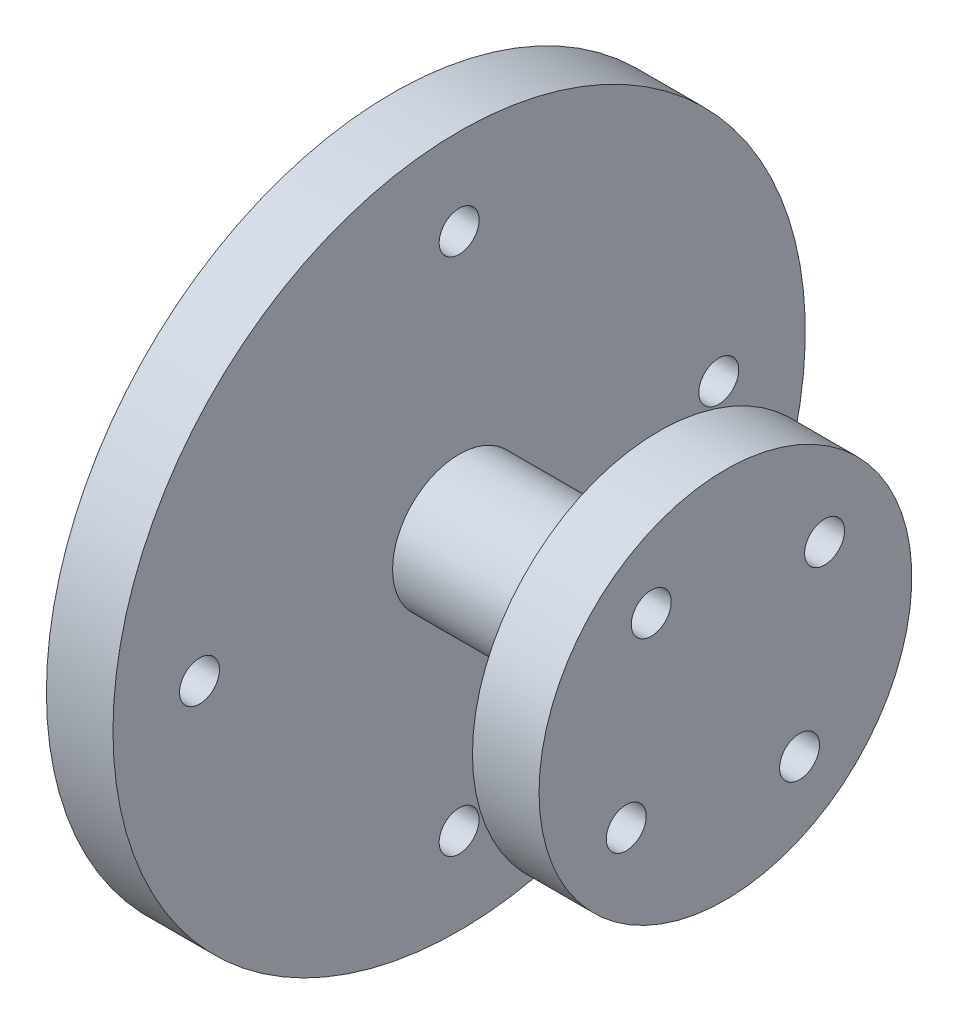
ISO-10303-21;
HEADER;
FILE_DESCRIPTION(('STEP AP214'),'2;1');
FILE_NAME('part.step','',(''),(''),'','','');
FILE_SCHEMA(('AUTOMOTIVE_DESIGN { 1 0 10303 214 1 1 1 1 }'));
ENDSEC;
DATA;
#1=APPLICATION_CONTEXT('core data for automotive mechanical design processes');
#2=APPLICATION_PROTOCOL_DEFINITION('international standard','automotive_design',2000,#1);
#3=PRODUCT_CONTEXT('',#1,'mechanical');
#4=PRODUCT('Part','Part','',(#3));
#5=PRODUCT_RELATED_PRODUCT_CATEGORY('part','',(#4));
#6=PRODUCT_DEFINITION_FORMATION('','',#4);
#7=PRODUCT_DEFINITION_CONTEXT('part definition',#1,'design');
#8=PRODUCT_DEFINITION('design','',#6,#7);
#9=PRODUCT_DEFINITION_SHAPE('','',#8);
#10=(LENGTH_UNIT() NAMED_UNIT(*) SI_UNIT(.MILLI.,.METRE.));
#11=(NAMED_UNIT(*) PLANE_ANGLE_UNIT() SI_UNIT($,.RADIAN.));
#12=(NAMED_UNIT(*) SI_UNIT($,.STERADIAN.) SOLID_ANGLE_UNIT());
#13=UNCERTAINTY_MEASURE_WITH_UNIT(LENGTH_MEASURE(1.E-05),#10,'distance_accuracy_value','');
#14=(GEOMETRIC_REPRESENTATION_CONTEXT(3) GLOBAL_UNCERTAINTY_ASSIGNED_CONTEXT((#13)) GLOBAL_UNIT_ASSIGNED_CONTEXT((#10,
#11,#12)) REPRESENTATION_CONTEXT('',''));
#15=CARTESIAN_POINT('',(0.,0.,0.));
#16=DIRECTION('',(0.,0.,1.));
#17=DIRECTION('',(1.,0.,0.));
#18=AXIS2_PLACEMENT_3D('',#15,#16,#17);
#19=CARTESIAN_POINT('',(0.,0.,0.));
#20=DIRECTION('',(1.,0.,0.));
#21=DIRECTION('',(0.,0.,-1.));
#22=AXIS2_PLACEMENT_3D('',#19,#20,#21);
#23=PLANE('',#22);
#24=CARTESIAN_POINT('',(0.,0.,-19.5));
#25=DIRECTION('',(-1.,0.,0.));
#26=DIRECTION('',(0.,1.,0.));
#27=AXIS2_PLACEMENT_3D('',#24,#25,#26);
#28=CIRCLE('',#27,1.5);
#29=CARTESIAN_POINT('',(0.,1.49999999999993,-19.5));
#30=VERTEX_POINT('',#29);
#31=EDGE_CURVE('E56',#30,#30,#28,.T.);
#32=ORIENTED_EDGE('',*,*,#31,.F.);
#33=EDGE_LOOP('',(#32));
#34=FACE_BOUND('',#33,.T.);
#35=CARTESIAN_POINT('',(0.,-19.5,0.));
#36=DIRECTION('',(-1.,0.,0.));
#37=DIRECTION('',(0.,0.,-1.));
#38=AXIS2_PLACEMENT_3D('',#35,#36,#37);
#39=CIRCLE('',#38,1.5);
#40=CARTESIAN_POINT('',(0.,-19.5,-1.5));
#41=VERTEX_POINT('',#40);
#42=EDGE_CURVE('E127',#41,#41,#39,.T.);
#43=ORIENTED_EDGE('',*,*,#42,.F.);
#44=EDGE_LOOP('',(#43));
#45=FACE_BOUND('',#44,.T.);
#46=CARTESIAN_POINT('',(0.,2.04251658322323E-13,19.5));
#47=DIRECTION('',(-1.,0.,0.));
#48=DIRECTION('',(0.,-1.,0.));
#49=AXIS2_PLACEMENT_3D('',#46,#47,#48);
#50=CIRCLE('',#49,1.5);
#51=CARTESIAN_POINT('',(0.,-1.4999999999998,19.5));
#52=VERTEX_POINT('',#51);
#53=EDGE_CURVE('E69',#52,#52,#50,.T.);
#54=ORIENTED_EDGE('',*,*,#53,.F.);
#55=EDGE_LOOP('',(#54));
#56=FACE_BOUND('',#55,.T.);
#57=CARTESIAN_POINT('',(0.,19.5,0.));
#58=DIRECTION('',(-1.,0.,0.));
#59=DIRECTION('',(0.,0.,1.));
#60=AXIS2_PLACEMENT_3D('',#57,#58,#59);
#61=CIRCLE('',#60,1.5);
#62=CARTESIAN_POINT('',(0.,19.5,1.5));
#63=VERTEX_POINT('',#62);
#64=EDGE_CURVE('E52',#63,#63,#61,.T.);
#65=ORIENTED_EDGE('',*,*,#64,.F.);
#66=EDGE_LOOP('',(#65));
#67=FACE_BOUND('',#66,.T.);
#68=CARTESIAN_POINT('',(0.,0.,0.));
#69=DIRECTION('',(-1.,0.,0.));
#70=DIRECTION('',(0.,0.,1.));
#71=AXIS2_PLACEMENT_3D('',#68,#69,#70);
#72=CIRCLE('',#71,26.);
#73=CARTESIAN_POINT('',(0.,0.,26.));
#74=VERTEX_POINT('',#73);
#75=EDGE_CURVE('E10',#74,#74,#72,.T.);
#76=ORIENTED_EDGE('',*,*,#75,.T.);
#77=EDGE_LOOP('',(#76));
#78=FACE_BOUND('',#77,.T.);
#79=ADVANCED_FACE('F32',(#34,#45,#56,#67,#78),#23,.F.);
#80=CARTESIAN_POINT('',(0.,0.,0.));
#81=DIRECTION('',(-1.,0.,0.));
#82=DIRECTION('',(0.,0.,1.));
#83=AXIS2_PLACEMENT_3D('',#80,#81,#82);
#84=CYLINDRICAL_SURFACE('',#83,26.);
#85=ORIENTED_EDGE('',*,*,#75,.F.);
#86=EDGE_LOOP('',(#85));
#87=FACE_BOUND('',#86,.T.);
#88=CARTESIAN_POINT('',(5.,0.,0.));
#89=DIRECTION('',(-1.,0.,0.));
#90=DIRECTION('',(0.,0.,1.));
#91=AXIS2_PLACEMENT_3D('',#88,#89,#90);
#92=CIRCLE('',#91,26.);
#93=CARTESIAN_POINT('',(5.,0.,26.));
#94=VERTEX_POINT('',#93);
#95=EDGE_CURVE('E39',#94,#94,#92,.T.);
#96=ORIENTED_EDGE('',*,*,#95,.T.);
#97=EDGE_LOOP('',(#96));
#98=FACE_BOUND('',#97,.T.);
#99=ADVANCED_FACE('F115',(#87,#98),#84,.T.);
#100=CARTESIAN_POINT('',(5.,26.,0.));
#101=DIRECTION('',(-1.,0.,0.));
#102=DIRECTION('',(0.,0.,1.));
#103=AXIS2_PLACEMENT_3D('',#100,#101,#102);
#104=PLANE('',#103);
#105=CARTESIAN_POINT('',(5.,0.,-19.5));
#106=DIRECTION('',(-1.,0.,0.));
#107=DIRECTION('',(0.,0.,1.));
#108=AXIS2_PLACEMENT_3D('',#105,#106,#107);
#109=CIRCLE('',#108,1.5);
#110=CARTESIAN_POINT('',(5.,0.,-18.));
#111=VERTEX_POINT('',#110);
#112=EDGE_CURVE('E35',#111,#111,#109,.T.);
#113=ORIENTED_EDGE('',*,*,#112,.T.);
#114=EDGE_LOOP('',(#113));
#115=FACE_BOUND('',#114,.T.);
#116=CARTESIAN_POINT('',(5.,-19.5,0.));
#117=DIRECTION('',(-1.,0.,0.));
#118=DIRECTION('',(0.,0.,1.));
#119=AXIS2_PLACEMENT_3D('',#116,#117,#118);
#120=CIRCLE('',#119,1.5);
#121=CARTESIAN_POINT('',(5.,-19.5,1.5));
#122=VERTEX_POINT('',#121);
#123=EDGE_CURVE('E55',#122,#122,#120,.T.);
#124=ORIENTED_EDGE('',*,*,#123,.T.);
#125=EDGE_LOOP('',(#124));
#126=FACE_BOUND('',#125,.T.);
#127=CARTESIAN_POINT('',(5.,2.04251658322323E-13,19.5));
#128=DIRECTION('',(-1.,0.,0.));
#129=DIRECTION('',(0.,0.,1.));
#130=AXIS2_PLACEMENT_3D('',#127,#128,#129);
#131=CIRCLE('',#130,1.5);
#132=CARTESIAN_POINT('',(5.,2.04251658322323E-13,21.));
#133=VERTEX_POINT('',#132);
#134=EDGE_CURVE('E53',#133,#133,#131,.T.);
#135=ORIENTED_EDGE('',*,*,#134,.T.);
#136=EDGE_LOOP('',(#135));
#137=FACE_BOUND('',#136,.T.);
#138=CARTESIAN_POINT('',(5.,19.5,0.));
#139=DIRECTION('',(-1.,0.,0.));
#140=DIRECTION('',(0.,0.,1.));
#141=AXIS2_PLACEMENT_3D('',#138,#139,#140);
#142=CIRCLE('',#141,1.5);
#143=CARTESIAN_POINT('',(5.,19.5,1.5));
#144=VERTEX_POINT('',#143);
#145=EDGE_CURVE('E48',#144,#144,#142,.T.);
#146=ORIENTED_EDGE('',*,*,#145,.T.);
#147=EDGE_LOOP('',(#146));
#148=FACE_BOUND('',#147,.T.);
#149=ORIENTED_EDGE('',*,*,#95,.F.);
#150=EDGE_LOOP('',(#149));
#151=FACE_BOUND('',#150,.T.);
#152=CARTESIAN_POINT('',(5.,0.,0.));
#153=DIRECTION('',(-1.,0.,0.));
#154=DIRECTION('',(0.,0.,1.));
#155=AXIS2_PLACEMENT_3D('',#152,#153,#154);
#156=CIRCLE('',#155,5.);
#157=CARTESIAN_POINT('',(5.,0.,5.));
#158=VERTEX_POINT('',#157);
#159=EDGE_CURVE('E44',#158,#158,#156,.T.);
#160=ORIENTED_EDGE('',*,*,#159,.T.);
#161=EDGE_LOOP('',(#160));
#162=FACE_BOUND('',#161,.T.);
#163=ADVANCED_FACE('F81',(#115,#126,#137,#148,#151,#162),#104,.F.);
#164=CARTESIAN_POINT('',(0.,0.,0.));
#165=DIRECTION('',(-1.,0.,0.));
#166=DIRECTION('',(0.,0.,1.));
#167=AXIS2_PLACEMENT_3D('',#164,#165,#166);
#168=CYLINDRICAL_SURFACE('',#167,5.);
#169=ORIENTED_EDGE('',*,*,#159,.F.);
#170=EDGE_LOOP('',(#169));
#171=FACE_BOUND('',#170,.T.);
#172=CARTESIAN_POINT('',(20.,0.,0.));
#173=DIRECTION('',(-1.,0.,0.));
#174=DIRECTION('',(0.,0.,1.));
#175=AXIS2_PLACEMENT_3D('',#172,#173,#174);
#176=CIRCLE('',#175,5.);
#177=CARTESIAN_POINT('',(20.,0.,5.));
#178=VERTEX_POINT('',#177);
#179=EDGE_CURVE('E76',#178,#178,#176,.T.);
#180=ORIENTED_EDGE('',*,*,#179,.T.);
#181=EDGE_LOOP('',(#180));
#182=FACE_BOUND('',#181,.T.);
#183=ADVANCED_FACE('F83',(#171,#182),#168,.T.);
#184=CARTESIAN_POINT('',(20.,5.,0.));
#185=DIRECTION('',(1.,0.,0.));
#186=DIRECTION('',(0.,0.,-1.));
#187=AXIS2_PLACEMENT_3D('',#184,#185,#186);
#188=PLANE('',#187);
#189=CARTESIAN_POINT('',(20.,-7.44819357410794,-5.56905849157802));
#190=DIRECTION('',(1.,0.,0.));
#191=DIRECTION('',(0.,0.,-1.));
#192=AXIS2_PLACEMENT_3D('',#189,#190,#191);
#193=CIRCLE('',#192,1.5);
#194=CARTESIAN_POINT('',(20.,-7.44819357410794,-7.06905849157801));
#195=VERTEX_POINT('',#194);
#196=EDGE_CURVE('E268',#195,#195,#193,.F.);
#197=ORIENTED_EDGE('',*,*,#196,.F.);
#198=EDGE_LOOP('',(#197));
#199=FACE_BOUND('',#198,.T.);
#200=CARTESIAN_POINT('',(20.,-5.56905849157804,7.44819357410792));
#201=DIRECTION('',(1.,0.,0.));
#202=DIRECTION('',(0.,0.,-1.));
#203=AXIS2_PLACEMENT_3D('',#200,#201,#202);
#204=CIRCLE('',#203,1.5);
#205=CARTESIAN_POINT('',(20.,-5.56905849157804,5.94819357410792));
#206=VERTEX_POINT('',#205);
#207=EDGE_CURVE('E273',#206,#206,#204,.F.);
#208=ORIENTED_EDGE('',*,*,#207,.F.);
#209=EDGE_LOOP('',(#208));
#210=FACE_BOUND('',#209,.T.);
#211=CARTESIAN_POINT('',(20.,7.44819357410798,5.56905849157796));
#212=DIRECTION('',(1.,0.,0.));
#213=DIRECTION('',(0.,0.,-1.));
#214=AXIS2_PLACEMENT_3D('',#211,#212,#213);
#215=CIRCLE('',#214,1.5);
#216=CARTESIAN_POINT('',(20.,7.44819357410798,4.06905849157796));
#217=VERTEX_POINT('',#216);
#218=EDGE_CURVE('E279',#217,#217,#215,.F.);
#219=ORIENTED_EDGE('',*,*,#218,.F.);
#220=EDGE_LOOP('',(#219));
#221=FACE_BOUND('',#220,.T.);
#222=CARTESIAN_POINT('',(20.,5.56905849157804,-7.44819357410792));
#223=DIRECTION('',(1.,0.,0.));
#224=DIRECTION('',(0.,0.,-1.));
#225=AXIS2_PLACEMENT_3D('',#222,#223,#224);
#226=CIRCLE('',#225,1.5);
#227=CARTESIAN_POINT('',(20.,5.56905849157804,-8.94819357410792));
#228=VERTEX_POINT('',#227);
#229=EDGE_CURVE('E134',#228,#228,#226,.F.);
#230=ORIENTED_EDGE('',*,*,#229,.F.);
#231=EDGE_LOOP('',(#230));
#232=FACE_BOUND('',#231,.T.);
#233=ORIENTED_EDGE('',*,*,#179,.F.);
#234=EDGE_LOOP('',(#233));
#235=FACE_BOUND('',#234,.T.);
#236=CARTESIAN_POINT('',(20.,0.,0.));
#237=DIRECTION('',(-1.,0.,0.));
#238=DIRECTION('',(0.,0.,1.));
#239=AXIS2_PLACEMENT_3D('',#236,#237,#238);
#240=CIRCLE('',#239,14.);
#241=CARTESIAN_POINT('',(20.,0.,14.));
#242=VERTEX_POINT('',#241);
#243=EDGE_CURVE('E73',#242,#242,#240,.T.);
#244=ORIENTED_EDGE('',*,*,#243,.T.);
#245=EDGE_LOOP('',(#244));
#246=FACE_BOUND('',#245,.T.);
#247=ADVANCED_FACE('F86',(#199,#210,#221,#232,#235,#246),#188,.F.);
#248=CARTESIAN_POINT('',(0.,0.,0.));
#249=DIRECTION('',(-1.,0.,0.));
#250=DIRECTION('',(0.,0.,1.));
#251=AXIS2_PLACEMENT_3D('',#248,#249,#250);
#252=CYLINDRICAL_SURFACE('',#251,14.);
#253=ORIENTED_EDGE('',*,*,#243,.F.);
#254=EDGE_LOOP('',(#253));
#255=FACE_BOUND('',#254,.T.);
#256=CARTESIAN_POINT('',(25.,0.,0.));
#257=DIRECTION('',(-1.,0.,0.));
#258=DIRECTION('',(0.,0.,1.));
#259=AXIS2_PLACEMENT_3D('',#256,#257,#258);
#260=CIRCLE('',#259,14.);
#261=CARTESIAN_POINT('',(25.,0.,14.));
#262=VERTEX_POINT('',#261);
#263=EDGE_CURVE('E51',#262,#262,#260,.T.);
#264=ORIENTED_EDGE('',*,*,#263,.T.);
#265=EDGE_LOOP('',(#264));
#266=FACE_BOUND('',#265,.T.);
#267=ADVANCED_FACE('F92',(#255,#266),#252,.T.);
#268=CARTESIAN_POINT('',(25.,14.,0.));
#269=DIRECTION('',(-1.,0.,0.));
#270=DIRECTION('',(0.,0.,1.));
#271=AXIS2_PLACEMENT_3D('',#268,#269,#270);
#272=PLANE('',#271);
#273=CARTESIAN_POINT('',(25.,-7.44819357410794,-5.56905849157802));
#274=DIRECTION('',(1.,0.,0.));
#275=DIRECTION('',(0.,-1.,0.));
#276=AXIS2_PLACEMENT_3D('',#273,#274,#275);
#277=CIRCLE('',#276,1.5);
#278=CARTESIAN_POINT('',(25.,-8.94819357410794,-5.56905849157801));
#279=VERTEX_POINT('',#278);
#280=EDGE_CURVE('E139',#279,#279,#277,.T.);
#281=ORIENTED_EDGE('',*,*,#280,.F.);
#282=EDGE_LOOP('',(#281));
#283=FACE_BOUND('',#282,.T.);
#284=CARTESIAN_POINT('',(25.,-5.56905849157804,7.44819357410792));
#285=DIRECTION('',(1.,0.,0.));
#286=DIRECTION('',(0.,0.,1.));
#287=AXIS2_PLACEMENT_3D('',#284,#285,#286);
#288=CIRCLE('',#287,1.5);
#289=CARTESIAN_POINT('',(25.,-5.56905849157804,8.94819357410792));
#290=VERTEX_POINT('',#289);
#291=EDGE_CURVE('E269',#290,#290,#288,.T.);
#292=ORIENTED_EDGE('',*,*,#291,.F.);
#293=EDGE_LOOP('',(#292));
#294=FACE_BOUND('',#293,.T.);
#295=CARTESIAN_POINT('',(25.,7.44819357410798,5.56905849157796));
#296=DIRECTION('',(1.,0.,0.));
#297=DIRECTION('',(0.,1.,0.));
#298=AXIS2_PLACEMENT_3D('',#295,#296,#297);
#299=CIRCLE('',#298,1.5);
#300=CARTESIAN_POINT('',(25.,8.94819357410798,5.56905849157795));
#301=VERTEX_POINT('',#300);
#302=EDGE_CURVE('E277',#301,#301,#299,.T.);
#303=ORIENTED_EDGE('',*,*,#302,.F.);
#304=EDGE_LOOP('',(#303));
#305=FACE_BOUND('',#304,.T.);
#306=CARTESIAN_POINT('',(25.,5.56905849157804,-7.44819357410792));
#307=DIRECTION('',(1.,0.,0.));
#308=DIRECTION('',(0.,0.,-1.));
#309=AXIS2_PLACEMENT_3D('',#306,#307,#308);
#310=CIRCLE('',#309,1.5);
#311=CARTESIAN_POINT('',(25.,5.56905849157804,-8.94819357410792));
#312=VERTEX_POINT('',#311);
#313=EDGE_CURVE('E132',#312,#312,#310,.T.);
#314=ORIENTED_EDGE('',*,*,#313,.F.);
#315=EDGE_LOOP('',(#314));
#316=FACE_BOUND('',#315,.T.);
#317=ORIENTED_EDGE('',*,*,#263,.F.);
#318=EDGE_LOOP('',(#317));
#319=FACE_BOUND('',#318,.T.);
#320=ADVANCED_FACE('F99',(#283,#294,#305,#316,#319),#272,.F.);
#321=CARTESIAN_POINT('',(25.,19.5,0.));
#322=DIRECTION('',(-1.,0.,0.));
#323=DIRECTION('',(0.,0.,1.));
#324=AXIS2_PLACEMENT_3D('',#321,#322,#323);
#325=CYLINDRICAL_SURFACE('',#324,1.5);
#326=ORIENTED_EDGE('',*,*,#64,.T.);
#327=EDGE_LOOP('',(#326));
#328=FACE_BOUND('',#327,.T.);
#329=ORIENTED_EDGE('',*,*,#145,.F.);
#330=EDGE_LOOP('',(#329));
#331=FACE_BOUND('',#330,.T.);
#332=ADVANCED_FACE('F104',(#328,#331),#325,.F.);
#333=CARTESIAN_POINT('',(25.,2.04251658322323E-13,19.5));
#334=DIRECTION('',(-1.,0.,0.));
#335=DIRECTION('',(0.,0.,1.));
#336=AXIS2_PLACEMENT_3D('',#333,#334,#335);
#337=CYLINDRICAL_SURFACE('',#336,1.5);
#338=ORIENTED_EDGE('',*,*,#53,.T.);
#339=EDGE_LOOP('',(#338));
#340=FACE_BOUND('',#339,.T.);
#341=ORIENTED_EDGE('',*,*,#134,.F.);
#342=EDGE_LOOP('',(#341));
#343=FACE_BOUND('',#342,.T.);
#344=ADVANCED_FACE('F110',(#340,#343),#337,.F.);
#345=CARTESIAN_POINT('',(25.,-19.5,0.));
#346=DIRECTION('',(-1.,0.,0.));
#347=DIRECTION('',(0.,0.,1.));
#348=AXIS2_PLACEMENT_3D('',#345,#346,#347);
#349=CYLINDRICAL_SURFACE('',#348,1.5);
#350=ORIENTED_EDGE('',*,*,#42,.T.);
#351=EDGE_LOOP('',(#350));
#352=FACE_BOUND('',#351,.T.);
#353=ORIENTED_EDGE('',*,*,#123,.F.);
#354=EDGE_LOOP('',(#353));
#355=FACE_BOUND('',#354,.T.);
#356=ADVANCED_FACE('F148',(#352,#355),#349,.F.);
#357=CARTESIAN_POINT('',(25.,0.,-19.5));
#358=DIRECTION('',(-1.,0.,0.));
#359=DIRECTION('',(0.,0.,1.));
#360=AXIS2_PLACEMENT_3D('',#357,#358,#359);
#361=CYLINDRICAL_SURFACE('',#360,1.5);
#362=ORIENTED_EDGE('',*,*,#31,.T.);
#363=EDGE_LOOP('',(#362));
#364=FACE_BOUND('',#363,.T.);
#365=ORIENTED_EDGE('',*,*,#112,.F.);
#366=EDGE_LOOP('',(#365));
#367=FACE_BOUND('',#366,.T.);
#368=ADVANCED_FACE('F144',(#364,#367),#361,.F.);
#369=CARTESIAN_POINT('',(-0.001000000000001,5.56905849157804,-7.44819357410792));
#370=DIRECTION('',(1.,0.,0.));
#371=DIRECTION('',(0.,0.,-1.));
#372=AXIS2_PLACEMENT_3D('',#369,#370,#371);
#373=CYLINDRICAL_SURFACE('',#372,1.5);
#374=ORIENTED_EDGE('',*,*,#313,.T.);
#375=EDGE_LOOP('',(#374));
#376=FACE_BOUND('',#375,.T.);
#377=ORIENTED_EDGE('',*,*,#229,.T.);
#378=EDGE_LOOP('',(#377));
#379=FACE_BOUND('',#378,.T.);
#380=ADVANCED_FACE('F147',(#376,#379),#373,.F.);
#381=CARTESIAN_POINT('',(-0.001000000000001,7.44819357410798,5.56905849157796));
#382=DIRECTION('',(1.,0.,0.));
#383=DIRECTION('',(0.,0.,-1.));
#384=AXIS2_PLACEMENT_3D('',#381,#382,#383);
#385=CYLINDRICAL_SURFACE('',#384,1.5);
#386=ORIENTED_EDGE('',*,*,#302,.T.);
#387=EDGE_LOOP('',(#386));
#388=FACE_BOUND('',#387,.T.);
#389=ORIENTED_EDGE('',*,*,#218,.T.);
#390=EDGE_LOOP('',(#389));
#391=FACE_BOUND('',#390,.T.);
#392=ADVANCED_FACE('F154',(#388,#391),#385,.F.);
#393=CARTESIAN_POINT('',(-0.001000000000001,-5.56905849157804,7.44819357410792));
#394=DIRECTION('',(1.,0.,0.));
#395=DIRECTION('',(0.,0.,-1.));
#396=AXIS2_PLACEMENT_3D('',#393,#394,#395);
#397=CYLINDRICAL_SURFACE('',#396,1.5);
#398=ORIENTED_EDGE('',*,*,#291,.T.);
#399=EDGE_LOOP('',(#398));
#400=FACE_BOUND('',#399,.T.);
#401=ORIENTED_EDGE('',*,*,#207,.T.);
#402=EDGE_LOOP('',(#401));
#403=FACE_BOUND('',#402,.T.);
#404=ADVANCED_FACE('F241',(#400,#403),#397,.F.);
#405=CARTESIAN_POINT('',(-0.001000000000001,-7.44819357410794,-5.56905849157802));
#406=DIRECTION('',(1.,0.,0.));
#407=DIRECTION('',(0.,0.,-1.));
#408=AXIS2_PLACEMENT_3D('',#405,#406,#407);
#409=CYLINDRICAL_SURFACE('',#408,1.5);
#410=ORIENTED_EDGE('',*,*,#280,.T.);
#411=EDGE_LOOP('',(#410));
#412=FACE_BOUND('',#411,.T.);
#413=ORIENTED_EDGE('',*,*,#196,.T.);
#414=EDGE_LOOP('',(#413));
#415=FACE_BOUND('',#414,.T.);
#416=ADVANCED_FACE('F249',(#412,#415),#409,.F.);
#417=CLOSED_SHELL('',(#79,#99,#163,#183,#247,#267,#320,#332,#344,#356,#368,#380,#392,#404,#416));
#418=MANIFOLD_SOLID_BREP('B2',#417);
#419=ADVANCED_BREP_SHAPE_REPRESENTATION('',(#18,#418),#14);
#420=SHAPE_DEFINITION_REPRESENTATION(#9,#419);
ENDSEC;
END-ISO-10303-21;
